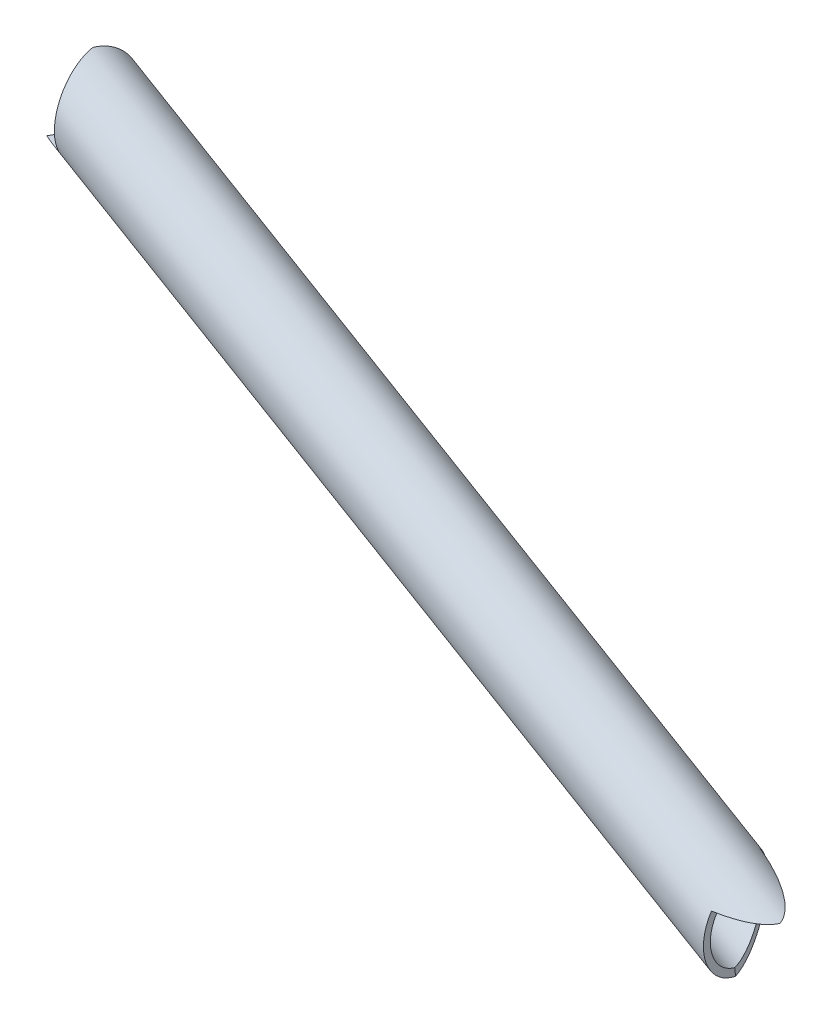
ISO-10303-21;
HEADER;
FILE_DESCRIPTION(('STEP AP214'),'2;1');
FILE_NAME('part.step','',(''),(''),'','','');
FILE_SCHEMA(('AUTOMOTIVE_DESIGN { 1 0 10303 214 1 1 1 1 }'));
ENDSEC;
DATA;
#1=APPLICATION_CONTEXT('core data for automotive mechanical design processes');
#2=APPLICATION_PROTOCOL_DEFINITION('international standard','automotive_design',2000,#1);
#3=PRODUCT_CONTEXT('',#1,'mechanical');
#4=PRODUCT('Part','Part','',(#3));
#5=PRODUCT_RELATED_PRODUCT_CATEGORY('part','',(#4));
#6=PRODUCT_DEFINITION_FORMATION('','',#4);
#7=PRODUCT_DEFINITION_CONTEXT('part definition',#1,'design');
#8=PRODUCT_DEFINITION('design','',#6,#7);
#9=PRODUCT_DEFINITION_SHAPE('','',#8);
#10=(LENGTH_UNIT() NAMED_UNIT(*) SI_UNIT(.MILLI.,.METRE.));
#11=(NAMED_UNIT(*) PLANE_ANGLE_UNIT() SI_UNIT($,.RADIAN.));
#12=(NAMED_UNIT(*) SI_UNIT($,.STERADIAN.) SOLID_ANGLE_UNIT());
#13=UNCERTAINTY_MEASURE_WITH_UNIT(LENGTH_MEASURE(1.E-05),#10,'distance_accuracy_value','');
#14=(GEOMETRIC_REPRESENTATION_CONTEXT(3) GLOBAL_UNCERTAINTY_ASSIGNED_CONTEXT((#13)) GLOBAL_UNIT_ASSIGNED_CONTEXT((#10,
#11,#12)) REPRESENTATION_CONTEXT('',''));
#15=CARTESIAN_POINT('',(0.,0.,0.));
#16=DIRECTION('',(0.,0.,1.));
#17=DIRECTION('',(1.,0.,0.));
#18=AXIS2_PLACEMENT_3D('',#15,#16,#17);
#19=CARTESIAN_POINT('',(-250.,0.,-1700.));
#20=DIRECTION('',(-0.214351342090107,0.914565726251124,0.342962147344171));
#21=DIRECTION('',(0.,-0.351123441588391,0.936329177569045));
#22=AXIS2_PLACEMENT_3D('',#19,#20,#21);
#23=CYLINDRICAL_SURFACE('',#22,9.49999999999999);
#24=CARTESIAN_POINT('',(-239.782773736137,-12.8737095959373,-1698.60180246691));
#25=CARTESIAN_POINT('',(-239.984904507563,-12.7886082078608,-1698.3482522127));
#26=CARTESIAN_POINT('',(-240.191938558142,-12.6860622632831,-1698.10432907822));
#27=CARTESIAN_POINT('',(-240.611050528479,-12.453208478034,-1697.63448879093));
#28=CARTESIAN_POINT('',(-240.823136021454,-12.3228562739344,-1697.40860121384));
#29=CARTESIAN_POINT('',(-241.250802241758,-12.0383143609904,-1696.9714194477));
#30=CARTESIAN_POINT('',(-241.466397334256,-11.8839282308109,-1696.76026837595));
#31=CARTESIAN_POINT('',(-241.896726561842,-11.5559011151564,-1696.35300708307));
#32=CARTESIAN_POINT('',(-242.111461102958,-11.3822706956704,-1696.15688870739));
#33=CARTESIAN_POINT('',(-242.479398763028,-11.0683054802184,-1695.83008751514));
#34=CARTESIAN_POINT('',(-242.633258640527,-10.9319727544481,-1695.69626019106));
#35=CARTESIAN_POINT('',(-242.93883974417,-10.6510457763852,-1695.43493723017));
#36=CARTESIAN_POINT('',(-243.090560750689,-10.5064506832752,-1695.30744224024));
#37=CARTESIAN_POINT('',(-243.391256106805,-10.2092561792934,-1695.0581103784));
#38=CARTESIAN_POINT('',(-243.540226914559,-10.0566473041076,-1694.9362805323));
#39=CARTESIAN_POINT('',(-243.834356309037,-9.7438092012214,-1694.69794566552));
#40=CARTESIAN_POINT('',(-243.979515114301,-9.583580411853,-1694.58144033931));
#41=CARTESIAN_POINT('',(-244.264176445696,-9.25644694323641,-1694.35392681337));
#42=CARTESIAN_POINT('',(-244.403706285591,-9.08958507573345,-1694.24289128481));
#43=CARTESIAN_POINT('',(-244.676696832635,-8.74815455964329,-1694.02518470078));
#44=CARTESIAN_POINT('',(-244.810156646132,-8.57358478367616,-1693.9185142882));
#45=CARTESIAN_POINT('',(-245.069068415303,-8.21671859382032,-1693.70937673426));
#46=CARTESIAN_POINT('',(-245.194533690912,-8.03443592140339,-1693.60690270872));
#47=CARTESIAN_POINT('',(-245.435417489178,-7.66140026734501,-1693.40573602836));
#48=CARTESIAN_POINT('',(-245.550840229976,-7.47065089328934,-1693.30704179576));
#49=CARTESIAN_POINT('',(-245.735413338959,-7.1395479240192,-1693.14286692153));
#50=CARTESIAN_POINT('',(-245.807944739844,-7.00155397032601,-1693.07643139454));
#51=CARTESIAN_POINT('',(-245.945363238874,-6.72091937404667,-1692.94541256909));
#52=CARTESIAN_POINT('',(-246.010250179179,-6.5782786355924,-1692.8808293089));
#53=CARTESIAN_POINT('',(-246.13070361321,-6.28842770874082,-1692.75381246663));
#54=CARTESIAN_POINT('',(-246.186283180957,-6.14122428015556,-1692.69137596873));
#55=CARTESIAN_POINT('',(-246.28638796432,-5.84208764528631,-1692.56895225868));
#56=CARTESIAN_POINT('',(-246.330914984382,-5.69015521562605,-1692.50896464807));
#57=CARTESIAN_POINT('',(-246.401064146233,-5.4056768167258,-1692.4011092055));
#58=CARTESIAN_POINT('',(-246.428543611619,-5.27375904827859,-1692.35280002927));
#59=CARTESIAN_POINT('',(-246.4730194334,-5.00720749076939,-1692.25895916768));
#60=CARTESIAN_POINT('',(-246.490018785702,-4.87257448927593,-1692.2134266919));
#61=CARTESIAN_POINT('',(-246.512579758404,-4.60138852262389,-1692.12587587786));
#62=CARTESIAN_POINT('',(-246.51815571958,-4.46483818168502,-1692.08385319714));
#63=CARTESIAN_POINT('',(-246.51735793179,-4.19052709141153,-1692.004046707));
#64=CARTESIAN_POINT('',(-246.510984388051,-4.05276636290512,-1691.96626282479));
#65=CARTESIAN_POINT('',(-246.486234587983,-3.77665666789734,-1691.89563935765));
#66=CARTESIAN_POINT('',(-246.467826110819,-3.63830711562667,-1691.86281333754));
#67=CARTESIAN_POINT('',(-246.419528281031,-3.36237048170564,-1691.80295386629));
#68=CARTESIAN_POINT('',(-246.389638708616,-3.22478341470327,-1691.77592052606));
#69=CARTESIAN_POINT('',(-246.31934589012,-2.95096486554247,-1691.72818344302));
#70=CARTESIAN_POINT('',(-246.278924637146,-2.81473612410064,-1691.70749067436));
#71=CARTESIAN_POINT('',(-246.188914149363,-2.54445036430349,-1691.67289867943));
#72=CARTESIAN_POINT('',(-246.139322307312,-2.41039397537639,-1691.65900138924));
#73=CARTESIAN_POINT('',(-246.016567472204,-2.10549818540933,-1691.63518991416));
#74=CARTESIAN_POINT('',(-245.940774073814,-1.93552837276018,-1691.62767575705));
#75=CARTESIAN_POINT('',(-245.779244833946,-1.60027876174664,-1691.62477114084));
#76=CARTESIAN_POINT('',(-245.693505728405,-1.43500052537825,-1691.62938467272));
#77=CARTESIAN_POINT('',(-245.514702018419,-1.10904672346668,-1691.65081181746));
#78=CARTESIAN_POINT('',(-245.421628959027,-0.948376770334281,-1691.66763970063));
#79=CARTESIAN_POINT('',(-245.2305657777,-0.631811360013427,-1691.7134730892));
#80=CARTESIAN_POINT('',(-245.132576031124,-0.475915539807728,-1691.74247766623));
#81=CARTESIAN_POINT('',(-244.930625609202,-0.16421280580895,-1691.81363633932));
#82=CARTESIAN_POINT('',(-244.826573992688,-0.00854930846927543,-1691.85615935165));
#83=CARTESIAN_POINT('',(-244.617108724015,0.297778397155349,-1691.95392180841));
#84=CARTESIAN_POINT('',(-244.511695068131,0.448442591762161,-1692.00916128763));
#85=CARTESIAN_POINT('',(-244.301079001451,0.744632655570074,-1692.13219796086));
#86=CARTESIAN_POINT('',(-244.195876537772,0.890160018648549,-1692.19999146751));
#87=CARTESIAN_POINT('',(-243.987005724939,1.17592326133598,-1692.34796858667));
#88=CARTESIAN_POINT('',(-243.883337442074,1.31615891270223,-1692.42815273285));
#89=CARTESIAN_POINT('',(-243.659529315486,1.61686914254613,-1692.61689938145));
#90=CARTESIAN_POINT('',(-243.539951152114,1.7762004049449,-1692.72796343162));
#91=CARTESIAN_POINT('',(-243.306495135971,2.08634710654732,-1692.966773229));
#92=CARTESIAN_POINT('',(-243.192617936426,2.23716157013431,-1693.09452088183));
#93=CARTESIAN_POINT('',(-242.97219015376,2.52951289049408,-1693.36605802462));
#94=CARTESIAN_POINT('',(-242.8656411977,2.67104768661416,-1693.5098510586));
#95=CARTESIAN_POINT('',(-242.661378121538,2.94391690089251,-1693.8125872656));
#96=CARTESIAN_POINT('',(-242.563663420567,3.07525198961939,-1693.97152944111));
#97=CARTESIAN_POINT('',(-242.381326570691,3.322770204905,-1694.2981698249));
#98=CARTESIAN_POINT('',(-242.296385135424,3.43930408637029,-1694.46542401763));
#99=CARTESIAN_POINT('',(-242.136975738934,3.66111675783399,-1694.8119611485));
#100=CARTESIAN_POINT('',(-242.062507659166,3.76639567521974,-1694.99124395047));
#101=CARTESIAN_POINT('',(-241.924862331054,3.96486248813064,-1695.36044000382));
#102=CARTESIAN_POINT('',(-241.861681641246,4.05805406663872,-1695.55034999177));
#103=CARTESIAN_POINT('',(-241.747161282898,4.23164642972749,-1695.93935913011));
#104=CARTESIAN_POINT('',(-241.695821212727,4.31204764812559,-1696.13845796855));
#105=CARTESIAN_POINT('',(-241.607567834595,4.45576081484985,-1696.53417145043));
#106=CARTESIAN_POINT('',(-241.570065243606,4.51972261103556,-1696.73041945719));
#107=CARTESIAN_POINT('',(-241.506150776301,4.63505208338413,-1697.12833714145));
#108=CARTESIAN_POINT('',(-241.479738468573,4.68642024940655,-1697.33000660773));
#109=CARTESIAN_POINT('',(-241.437897101561,4.77618367232106,-1697.73730214879));
#110=CARTESIAN_POINT('',(-241.422466816218,4.81458037712624,-1697.94292777925));
#111=CARTESIAN_POINT('',(-241.402279785461,4.87811332158674,-1698.35673297903));
#112=CARTESIAN_POINT('',(-241.397523284611,4.90324925739433,-1698.56491260676));
#113=CARTESIAN_POINT('',(-241.39819594792,4.94027005706469,-1698.98523507803));
#114=CARTESIAN_POINT('',(-241.403762364133,4.95197296458268,-1699.19739366199));
#115=CARTESIAN_POINT('',(-241.424644473177,4.96130952944614,-1699.62153431078));
#116=CARTESIAN_POINT('',(-241.439960270711,4.95894303569219,-1699.83351637367));
#117=CARTESIAN_POINT('',(-241.479457167178,4.93992859321801,-1700.25618931253));
#118=CARTESIAN_POINT('',(-241.503645927718,4.92326828541108,-1700.46687891214));
#119=CARTESIAN_POINT('',(-241.559776436016,4.87541098332842,-1700.88555371612));
#120=CARTESIAN_POINT('',(-241.591718308007,4.84421375611319,-1701.0935388771));
#121=CARTESIAN_POINT('',(-241.66416628956,4.76460327525255,-1701.51824522193));
#122=CARTESIAN_POINT('',(-241.705076713404,4.71525376813738,-1701.73472270307));
#123=CARTESIAN_POINT('',(-241.792176829963,4.59929836934876,-1702.16197411789));
#124=CARTESIAN_POINT('',(-241.838367545024,4.532689132746,-1702.37274693725));
#125=CARTESIAN_POINT('',(-241.933568215952,4.38157403378369,-1702.78695182242));
#126=CARTESIAN_POINT('',(-241.982576054687,4.29708148630177,-1702.99038921859));
#127=CARTESIAN_POINT('',(-242.080420264585,4.10931046422812,-1703.3884172921));
#128=CARTESIAN_POINT('',(-242.129256706056,4.00604091945804,-1703.58301211997));
#129=CARTESIAN_POINT('',(-242.207765661517,3.81656566505128,-1703.89995785386));
#130=CARTESIAN_POINT('',(-242.238512463013,3.73570469218492,-1704.0252527585));
#131=CARTESIAN_POINT('',(-242.296834694988,3.56480956545219,-1704.27017982362));
#132=CARTESIAN_POINT('',(-242.324411102474,3.47477825378458,-1704.3898137219));
#133=CARTESIAN_POINT('',(-242.374858152179,3.28567467697022,-1704.6223525378));
#134=CARTESIAN_POINT('',(-242.397738825328,3.18662235033572,-1704.73527142527));
#135=CARTESIAN_POINT('',(-242.437345779172,2.97952148784547,-1704.95373326378));
#136=CARTESIAN_POINT('',(-242.454072138999,2.87147306768104,-1705.05927630966));
#137=CARTESIAN_POINT('',(-242.480089087078,2.64588128959922,-1705.26302767651));
#138=CARTESIAN_POINT('',(-242.489306442902,2.52825644403712,-1705.36115548604));
#139=CARTESIAN_POINT('',(-242.49892419503,2.28548555176499,-1705.54809462404));
#140=CARTESIAN_POINT('',(-242.49932524565,2.16034006390145,-1705.63690664341));
#141=CARTESIAN_POINT('',(-242.490739545977,1.90389302304525,-1705.80471017669));
#142=CARTESIAN_POINT('',(-242.48175013867,1.77258973775727,-1705.88369890402));
#143=CARTESIAN_POINT('',(-242.454429702198,1.50542550653194,-1706.03170911728));
#144=CARTESIAN_POINT('',(-242.436097322473,1.36956390432671,-1706.10072916035));
#145=CARTESIAN_POINT('',(-242.386909492675,1.07203352632054,-1706.23970639088));
#146=CARTESIAN_POINT('',(-242.3544832543,0.909815982047556,-1706.3079270159));
#147=CARTESIAN_POINT('',(-242.279244026843,0.583163174762814,-1706.43216714881));
#148=CARTESIAN_POINT('',(-242.236428136462,0.418727304420591,-1706.48818324029));
#149=CARTESIAN_POINT('',(-242.142046925034,0.0885597679179744,-1706.5893703803));
#150=CARTESIAN_POINT('',(-242.090457988809,-0.0771742124945321,-1706.63451134108));
#151=CARTESIAN_POINT('',(-241.980293387157,-0.408736568126574,-1706.71501578558));
#152=CARTESIAN_POINT('',(-241.921714529352,-0.574564951786755,-1706.75037477711));
#153=CARTESIAN_POINT('',(-241.801426198685,-0.89949240345144,-1706.81122707592));
#154=CARTESIAN_POINT('',(-241.739920610906,-1.05860747043176,-1706.83704453668));
#155=CARTESIAN_POINT('',(-241.612989303708,-1.37622462586454,-1706.88146211052));
#156=CARTESIAN_POINT('',(-241.547564214524,-1.53472680852544,-1706.90006338034));
#157=CARTESIAN_POINT('',(-241.346714649815,-2.00956289118101,-1706.94612423069));
#158=CARTESIAN_POINT('',(-241.206813675778,-2.32497053804832,-1706.96379532817));
#159=CARTESIAN_POINT('',(-240.920470658444,-2.95434518568089,-1706.97677358879));
#160=CARTESIAN_POINT('',(-240.77400876207,-3.26830412796805,-1706.9720075938));
#161=CARTESIAN_POINT('',(-240.479120942279,-3.89412260849083,-1706.94189877715));
#162=CARTESIAN_POINT('',(-240.330695858963,-4.20598296373506,-1706.91656449375));
#163=CARTESIAN_POINT('',(-240.012651141794,-4.87522713338875,-1706.84073791011));
#164=CARTESIAN_POINT('',(-239.843230561255,-5.2323429802344,-1706.78701319758));
#165=CARTESIAN_POINT('',(-239.510271699,-5.94455982490911,-1706.65287721988));
#166=CARTESIAN_POINT('',(-239.346736279115,-6.29965977360659,-1706.57245316063));
#167=CARTESIAN_POINT('',(-239.030756957091,-7.00528591467498,-1706.3835930406));
#168=CARTESIAN_POINT('',(-238.878263942306,-7.35582583520751,-1706.27529220658));
#169=CARTESIAN_POINT('',(-238.588664910024,-8.05200602267758,-1706.02751994635));
#170=CARTESIAN_POINT('',(-238.451543340653,-8.3976509269423,-1705.8880804597));
#171=CARTESIAN_POINT('',(-238.212971938757,-9.04314944291669,-1705.59091168341));
#172=CARTESIAN_POINT('',(-238.109256648542,-9.34385372025536,-1705.43688807558));
#173=CARTESIAN_POINT('',(-237.925116634892,-9.93490781636197,-1705.09631763009));
#174=CARTESIAN_POINT('',(-237.844718209843,-10.2252456220873,-1704.90973444629));
#175=CARTESIAN_POINT('',(-237.747672727899,-10.648375520144,-1704.60140589349));
#176=CARTESIAN_POINT('',(-237.719137777752,-10.7882649139691,-1704.49305028107));
#177=CARTESIAN_POINT('',(-237.671590659726,-11.0617573316153,-1704.26660353725));
#178=CARTESIAN_POINT('',(-237.652579527098,-11.1953596705964,-1704.1485113491));
#179=CARTESIAN_POINT('',(-237.625522449639,-11.4540623348647,-1703.9028159078));
#180=CARTESIAN_POINT('',(-237.617446673069,-11.5791849024489,-1703.77523953596));
#181=CARTESIAN_POINT('',(-237.613546418331,-11.8191361309444,-1703.51058289891));
#182=CARTESIAN_POINT('',(-237.617714816277,-11.933970737515,-1703.37350820532));
#183=CARTESIAN_POINT('',(-237.636018667464,-12.1168557276919,-1703.13521580682));
#184=CARTESIAN_POINT('',(-237.646606667384,-12.1882603842567,-1703.03628124027));
#185=CARTESIAN_POINT('',(-237.67432186576,-12.3243891376809,-1702.83480749898));
#186=CARTESIAN_POINT('',(-237.691447457684,-12.3891148708436,-1702.73226921541));
#187=CARTESIAN_POINT('',(-237.732350388845,-12.5111652059165,-1702.52424096198));
#188=CARTESIAN_POINT('',(-237.756123606492,-12.5684943616898,-1702.4187528574));
#189=CARTESIAN_POINT('',(-237.810288770367,-12.6752333893366,-1702.20548431336));
#190=CARTESIAN_POINT('',(-237.840680951247,-12.7246429803415,-1702.09770379276));
#191=CARTESIAN_POINT('',(-237.907879745562,-12.8151487638807,-1701.88064763044));
#192=CARTESIAN_POINT('',(-237.944687125655,-12.8562439615206,-1701.77137181147));
#193=CARTESIAN_POINT('',(-238.024363023426,-12.9299352428935,-1701.5521262838));
#194=CARTESIAN_POINT('',(-238.06723365976,-12.9625283444063,-1701.44215634545));
#195=CARTESIAN_POINT('',(-238.158573577441,-13.0192348076345,-1701.22226477725));
#196=CARTESIAN_POINT('',(-238.207046942581,-13.0433419315341,-1701.11234324201));
#197=CARTESIAN_POINT('',(-238.309005833478,-13.083253791111,-1700.89331212427));
#198=CARTESIAN_POINT('',(-238.362492519733,-13.0990565988596,-1700.78420273612));
#199=CARTESIAN_POINT('',(-238.489987459262,-13.1261190930141,-1700.53603333144));
#200=CARTESIAN_POINT('',(-238.565458745107,-13.1347453737587,-1700.39743190635));
#201=CARTESIAN_POINT('',(-238.722458862374,-13.1397594948343,-1700.12350669711));
#202=CARTESIAN_POINT('',(-238.80399009988,-13.1361424483308,-1699.98818424344));
#203=CARTESIAN_POINT('',(-239.055962897896,-13.1085785299719,-1699.58800431886));
#204=CARTESIAN_POINT('',(-239.233853076416,-13.0679311750164,-1699.32880194807));
#205=CARTESIAN_POINT('',(-239.477296611977,-12.990431107731,-1698.99730550257));
#206=CARTESIAN_POINT('',(-239.537702005632,-12.9695066218156,-1698.91685062366));
#207=CARTESIAN_POINT('',(-239.659510995368,-12.924165296314,-1698.75789946498));
#208=CARTESIAN_POINT('',(-239.720912737346,-12.8997544026125,-1698.67940011253));
#209=CARTESIAN_POINT('',(-239.782773736137,-12.8737095959373,-1698.60180246691));
#210=B_SPLINE_CURVE_WITH_KNOTS('',3,(#24,#25,#26,#27,#28,#29,#30,#31,#32,#33,#34,#35,#36,#37,
#38,#39,#40,#41,#42,#43,#44,#45,#46,#47,#48,#49,#50,#51,#52,#53,#54,#55,#56,#57,#58,#59,#60,#61,
#62,#63,#64,#65,#66,#67,#68,#69,#70,#71,#72,#73,#74,#75,#76,#77,#78,#79,#80,#81,#82,#83,#84,#85,
#86,#87,#88,#89,#90,#91,#92,#93,#94,#95,#96,#97,#98,#99,#100,#101,#102,#103,#104,#105,#106,#107,
#108,#109,#110,#111,#112,#113,#114,#115,#116,#117,#118,#119,#120,#121,#122,#123,#124,#125,#126,
#127,#128,#129,#130,#131,#132,#133,#134,#135,#136,#137,#138,#139,#140,#141,#142,#143,#144,#145,
#146,#147,#148,#149,#150,#151,#152,#153,#154,#155,#156,#157,#158,#159,#160,#161,#162,#163,#164,
#165,#166,#167,#168,#169,#170,#171,#172,#173,#174,#175,#176,#177,#178,#179,#180,#181,#182,#183,
#184,#185,#186,#187,#188,#189,#190,#191,#192,#193,#194,#195,#196,#197,#198,#199,#200,#201,#202,
#203,#204,#205,#206,#207,#208,#209),.UNSPECIFIED.,.T.,.F.,(4,2,2,2,2,2,2,2,2,2,2,2,2,2,2,2,2,2,
2,2,2,2,2,2,2,2,2,2,2,2,2,2,2,2,2,2,2,2,2,2,2,2,2,2,2,2,2,2,2,2,2,2,2,2,2,2,2,2,2,2,2,2,2,2,2,2,
2,2,2,2,2,2,2,2,2,2,2,2,2,2,2,2,2,2,2,2,2,2,2,2,2,2,4),(0.,1.00555230707435,2.01272108217907,
3.02860094306077,4.04392577720049,4.7795868671537,5.51532295522028,6.25194839882344,
6.98853151952512,7.72095484963138,8.45348566317281,9.18476222438442,9.91573013146101,
10.4239092480488,10.9320988555603,11.4395685122029,11.946955264471,12.3760107477622,
12.8049435217558,13.2333374883864,13.6617240976458,14.0912623388206,14.520808803386,
14.9510945747321,15.3815028669501,15.939431952306,16.4975446641396,17.0563104837928,
17.615033709778,18.1905448259915,18.7660575166787,19.3414014360012,19.9167701428227,
20.6001618248875,21.2836316327246,21.9672527021122,22.650828789466,23.3124919734014,
23.9741476676247,24.635601280968,25.2970324546534,25.9256551959606,26.5542534815919,
27.1827815780112,27.8113240754461,28.4482835611713,29.0852498875843,29.7227675199586,
30.3602953682623,31.036815178347,31.7134661959115,32.3896151794566,33.0654434422817,
33.5218620809983,33.9781396880808,34.433432219272,34.8887188962268,35.3483943734266,
35.8080357350366,36.2678071866068,36.7276451186442,37.2636110670955,37.7997268559651,
38.3373092839496,38.875138178562,39.3925059041472,39.9097906619757,40.9451901196755,
41.9839679234496,43.0223147318742,44.2181167221879,45.4144925577534,46.6051708408579,
47.7946333850762,48.8530951351698,49.9127460904308,50.4499362675274,50.9871848251859,
51.5229647916373,52.0584330931782,52.4254746174124,52.7924260037015,53.1591503792384,
53.5258877578331,53.8926689940382,54.2595787110324,54.6267575731171,54.9940216417733,
55.4674405270594,55.941048396306,56.8878195736468,57.1960828510787,57.5038265440026),.UNSPECIFIED.);
#211=CARTESIAN_POINT('',(-238.275469808564,-8.87542708308326,-1705.66706450957));
#212=VERTEX_POINT('',#211);
#213=CARTESIAN_POINT('',(-242.13529505725,-11.3593996180337,-1696.13718002754));
#214=VERTEX_POINT('',#213);
#215=EDGE_CURVE('E177',#212,#214,#210,.T.);
#216=ORIENTED_EDGE('',*,*,#215,.F.);
#217=CARTESIAN_POINT('',(-232.820393226593,-73.299655566537,-1727.48737083745));
#218=DIRECTION('',(-0.970142500145332,0.,-0.242535625036333));
#219=DIRECTION('',(-0.0940407512885348,0.921768805422756,0.376163005154139));
#220=AXIS2_PLACEMENT_3D('',#217,#218,#219);
#221=ELLIPSE('',#220,76.1396046117399,9.49999999999999);
#222=CARTESIAN_POINT('',(-238.075805823074,-10.,-1706.46572045153));
#223=VERTEX_POINT('',#222);
#224=EDGE_CURVE('E241',#212,#223,#221,.T.);
#225=ORIENTED_EDGE('',*,*,#224,.T.);
#226=CARTESIAN_POINT('',(-247.65625,-10.,-1703.75));
#227=DIRECTION('',(0.,1.,0.));
#228=DIRECTION('',(-0.52999894000318,0.,0.847998304005088));
#229=AXIS2_PLACEMENT_3D('',#226,#227,#228);
#230=ELLIPSE('',#229,10.3874437094218,9.49999999999999);
#231=CARTESIAN_POINT('',(-238.168722071905,-10.,-1706.90270720181));
#232=VERTEX_POINT('',#231);
#233=EDGE_CURVE('E135',#223,#232,#230,.T.);
#234=ORIENTED_EDGE('',*,*,#233,.T.);
#235=CARTESIAN_POINT('',(-250.,-1.12648982103456E-13,-1700.));
#236=DIRECTION('',(-0.71506324481371,-0.537405268133699,-0.447079560815114));
#237=DIRECTION('',(-0.649756055025887,0.746861985871362,0.141471703946348));
#238=AXIS2_PLACEMENT_3D('',#235,#236,#237);
#239=ELLIPSE('',#238,19.3266576466284,9.49999999999999);
#240=CARTESIAN_POINT('',(-242.343886979706,-13.1916255339826,-1696.38846375506));
#241=VERTEX_POINT('',#240);
#242=EDGE_CURVE('E141',#232,#241,#239,.T.);
#243=ORIENTED_EDGE('',*,*,#242,.T.);
#244=CARTESIAN_POINT('',(-250.,0.,-1700.));
#245=DIRECTION('',(-0.508456010272344,-0.0599232902931692,0.859000398660194));
#246=DIRECTION('',(0.0394871934442316,-0.998148808069163,-0.0462570913915509));
#247=AXIS2_PLACEMENT_3D('',#244,#245,#246);
#248=ELLIPSE('',#247,27.2370926599014,9.49999999999999);
#249=EDGE_CURVE('E244',#214,#241,#248,.F.);
#250=ORIENTED_EDGE('',*,*,#249,.F.);
#251=EDGE_LOOP('',(#216,#225,#234,#243,#250));
#252=FACE_BOUND('',#251,.T.);
#253=ADVANCED_FACE('F41',(#252),#23,.F.);
#254=CARTESIAN_POINT('',(-115.,920.,-1946.51325703663));
#255=DIRECTION('',(-0.140336447675245,-0.956366902675742,0.256257739239816));
#256=DIRECTION('',(0.,-0.258819045102517,-0.965925826289069));
#257=AXIS2_PLACEMENT_3D('',#254,#255,#256);
#258=CYLINDRICAL_SURFACE('',#257,9.49999999999999);
#259=CARTESIAN_POINT('',(-250.,-2.08166817117217E-13,-1700.));
#260=DIRECTION('',(-0.872585214874351,-0.470357898518335,0.131751622700061));
#261=DIRECTION('',(-0.488413504418264,0.843958437392222,-0.221780081739432));
#262=AXIS2_PLACEMENT_3D('',#259,#260,#261);
#263=ELLIPSE('',#262,15.6752068398415,9.49999999999999);
#264=CARTESIAN_POINT('',(-243.437962250656,-10.,-1692.24026153614));
#265=VERTEX_POINT('',#264);
#266=EDGE_CURVE('E247',#241,#265,#263,.T.);
#267=ORIENTED_EDGE('',*,*,#266,.T.);
#268=CARTESIAN_POINT('',(-251.467391304348,-10.,-1697.32050807569));
#269=DIRECTION('',(0.,1.,0.));
#270=DIRECTION('',(-0.480327336741099,0.,0.87708930536132));
#271=AXIS2_PLACEMENT_3D('',#268,#269,#270);
#272=ELLIPSE('',#271,9.93342614996473,9.49999999999999);
#273=CARTESIAN_POINT('',(-242.494210145051,-10.,-1694.16838502064));
#274=VERTEX_POINT('',#273);
#275=EDGE_CURVE('E142',#265,#274,#272,.T.);
#276=ORIENTED_EDGE('',*,*,#275,.T.);
#277=CARTESIAN_POINT('',(-242.272833901891,-11.8252632103567,-1698.86391406331));
#278=CARTESIAN_POINT('',(-242.24901606336,-11.8352931326053,-1698.71191995643));
#279=CARTESIAN_POINT('',(-242.227554861436,-11.8397636611331,-1698.55920272901));
#280=CARTESIAN_POINT('',(-242.189765147747,-11.837049824688,-1698.25324861373));
#281=CARTESIAN_POINT('',(-242.173435405501,-11.8298682563368,-1698.10001185937));
#282=CARTESIAN_POINT('',(-242.14626328473,-11.8034890967169,-1697.79415643685));
#283=CARTESIAN_POINT('',(-242.135418153662,-11.7842975436987,-1697.64153749686));
#284=CARTESIAN_POINT('',(-242.119444743218,-11.7337661787255,-1697.33800918353));
#285=CARTESIAN_POINT('',(-242.114316620254,-11.7024260344243,-1697.18709985707));
#286=CARTESIAN_POINT('',(-242.109884046011,-11.627661608996,-1696.88795342179));
#287=CARTESIAN_POINT('',(-242.110589153967,-11.5842176052093,-1696.73972109838));
#288=CARTESIAN_POINT('',(-242.117809673678,-11.4856611713357,-1696.44733802221));
#289=CARTESIAN_POINT('',(-242.124325091247,-11.4305487295731,-1696.30318727355));
#290=CARTESIAN_POINT('',(-242.14299012713,-11.3092753986418,-1696.01996776961));
#291=CARTESIAN_POINT('',(-242.155140787984,-11.2431124665436,-1695.88089995983));
#292=CARTESIAN_POINT('',(-242.18478287183,-11.1005288473031,-1695.60866192606));
#293=CARTESIAN_POINT('',(-242.202276495637,-11.0241039404413,-1695.47549415829));
#294=CARTESIAN_POINT('',(-242.241706602052,-10.8639913401546,-1695.21903359039));
#295=CARTESIAN_POINT('',(-242.263519650165,-10.7805359645552,-1695.0955762916));
#296=CARTESIAN_POINT('',(-242.311433158011,-10.6056591086608,-1694.85528959482));
#297=CARTESIAN_POINT('',(-242.337534935487,-10.5142351840386,-1694.73846224883));
#298=CARTESIAN_POINT('',(-242.421589659603,-10.2294274489904,-1694.39840164018));
#299=CARTESIAN_POINT('',(-242.485316221453,-10.0254113865809,-1694.18543828878));
#300=CARTESIAN_POINT('',(-242.665405890714,-9.46974373005584,-1693.67076583362));
#301=CARTESIAN_POINT('',(-242.790750967265,-9.10155134000096,-1693.39003346173));
#302=CARTESIAN_POINT('',(-242.991609744405,-8.5229342649008,-1693.01765218428));
#303=CARTESIAN_POINT('',(-243.060857574004,-8.32524279309952,-1692.90145741457));
#304=CARTESIAN_POINT('',(-243.202346543797,-7.92255633564345,-1692.68446294646));
#305=CARTESIAN_POINT('',(-243.274587521541,-7.71756174644255,-1692.58366241395));
#306=CARTESIAN_POINT('',(-243.451878957689,-7.21314319568169,-1692.35688458292));
#307=CARTESIAN_POINT('',(-243.557813202092,-6.91064660297127,-1692.23843903713));
#308=CARTESIAN_POINT('',(-243.769612757725,-6.29611597103512,-1692.02909820822));
#309=CARTESIAN_POINT('',(-243.875477987832,-5.98407624247797,-1691.93821972666));
#310=CARTESIAN_POINT('',(-244.083168540565,-5.35238812460415,-1691.78267096846));
#311=CARTESIAN_POINT('',(-244.184995390003,-5.03274268537954,-1691.71799070004));
#312=CARTESIAN_POINT('',(-244.379906489696,-4.38684709317715,-1691.61414740701));
#313=CARTESIAN_POINT('',(-244.472996381335,-4.06060136971424,-1691.57496781843));
#314=CARTESIAN_POINT('',(-244.606024002778,-3.54830955358096,-1691.5341492602));
#315=CARTESIAN_POINT('',(-244.651213963526,-3.36430913250628,-1691.52356634036));
#316=CARTESIAN_POINT('',(-244.73539389497,-2.99462457528309,-1691.51067583913));
#317=CARTESIAN_POINT('',(-244.774385317048,-2.80894084407528,-1691.50836631781));
#318=CARTESIAN_POINT('',(-244.844322433224,-2.43636783466992,-1691.51242892684));
#319=CARTESIAN_POINT('',(-244.875278931164,-2.2494805252014,-1691.5187893268));
#320=CARTESIAN_POINT('',(-244.927010642199,-1.87490787464769,-1691.54074034348));
#321=CARTESIAN_POINT('',(-244.947788543968,-1.68722275753047,-1691.55632852029));
#322=CARTESIAN_POINT('',(-244.983899887435,-1.21595106468532,-1691.60802566084));
#323=CARTESIAN_POINT('',(-244.99106599774,-0.932222626481231,-1691.65054336379));
#324=CARTESIAN_POINT('',(-244.97306276575,-0.51199365925161,-1691.73332889125));
#325=CARTESIAN_POINT('',(-244.962287821767,-0.372910155482079,-1691.76406308392));
#326=CARTESIAN_POINT('',(-244.930322245975,-0.0975358340346672,-1691.83212194064));
#327=CARTESIAN_POINT('',(-244.909132154636,0.0387551281727997,-1691.86944626264));
#328=CARTESIAN_POINT('',(-244.855651887986,0.308341495788431,-1691.95113163469));
#329=CARTESIAN_POINT('',(-244.823266494809,0.441600398370244,-1691.99555122859));
#330=CARTESIAN_POINT('',(-244.747594749901,0.702502184782535,-1692.09109107964));
#331=CARTESIAN_POINT('',(-244.704308623936,0.830145184859961,-1692.14221119802));
#332=CARTESIAN_POINT('',(-244.607559865315,1.07882753043034,-1692.25094339843));
#333=CARTESIAN_POINT('',(-244.55408449729,1.19985836526573,-1692.30856356762));
#334=CARTESIAN_POINT('',(-244.438267358558,1.43440198727526,-1692.42985644698));
#335=CARTESIAN_POINT('',(-244.375924137948,1.54791354058266,-1692.49353014636));
#336=CARTESIAN_POINT('',(-244.231849176212,1.78708925468244,-1692.63865249777));
#337=CARTESIAN_POINT('',(-244.148655627833,1.91118906800555,-1692.72122405627));
#338=CARTESIAN_POINT('',(-243.97460353199,2.14846477229859,-1692.89361625566));
#339=CARTESIAN_POINT('',(-243.883743141851,2.2616380230451,-1692.983438639));
#340=CARTESIAN_POINT('',(-243.696519452444,2.4777642043743,-1693.17003853497));
#341=CARTESIAN_POINT('',(-243.600144237638,2.58069357899285,-1693.26683123416));
#342=CARTESIAN_POINT('',(-243.404079253869,2.77669565039718,-1693.46685196926));
#343=CARTESIAN_POINT('',(-243.304388457721,2.86976525448552,-1693.57008200834));
#344=CARTESIAN_POINT('',(-243.062579930743,3.08259901803736,-1693.82590355888));
#345=CARTESIAN_POINT('',(-242.919674413305,3.1978537076722,-1693.98151540268));
#346=CARTESIAN_POINT('',(-242.63450080919,3.41157334294483,-1694.30444668055));
#347=CARTESIAN_POINT('',(-242.492232958995,3.51003249249152,-1694.47177012827));
#348=CARTESIAN_POINT('',(-242.211390035031,3.69117658924498,-1694.81772958253));
#349=CARTESIAN_POINT('',(-242.072815604293,3.77385880489259,-1694.9963675409));
#350=CARTESIAN_POINT('',(-241.802016270886,3.92403187393809,-1695.36447826269));
#351=CARTESIAN_POINT('',(-241.669790620829,3.99152451894532,-1695.55394974499));
#352=CARTESIAN_POINT('',(-241.412555771101,4.11229640413755,-1695.94542563187));
#353=CARTESIAN_POINT('',(-241.287645857654,4.16540509478925,-1696.14754815525));
#354=CARTESIAN_POINT('',(-241.048957979451,4.25641564543364,-1696.56159165327));
#355=CARTESIAN_POINT('',(-240.935180469238,4.29431688469336,-1696.77351302748));
#356=CARTESIAN_POINT('',(-240.720997657736,4.35474825629773,-1697.20594329374));
#357=CARTESIAN_POINT('',(-240.620581998707,4.37729035114529,-1697.42644536086));
#358=CARTESIAN_POINT('',(-240.435057065578,4.40683522157037,-1697.8748180535));
#359=CARTESIAN_POINT('',(-240.349946140552,4.41383967412229,-1698.10268788111));
#360=CARTESIAN_POINT('',(-240.201907582693,4.41217604158927,-1698.54893485106));
#361=CARTESIAN_POINT('',(-240.13789097887,4.40450594564613,-1698.76695408917));
#362=CARTESIAN_POINT('',(-240.026157465329,4.37535730351722,-1699.20624138757));
#363=CARTESIAN_POINT('',(-239.978440034478,4.35387919887842,-1699.42750934375));
#364=CARTESIAN_POINT('',(-239.900387444556,4.29719775925286,-1699.87119408815));
#365=CARTESIAN_POINT('',(-239.870039785266,4.26200432528952,-1700.09360993369));
#366=CARTESIAN_POINT('',(-239.827387548075,4.17813365676455,-1700.53762052918));
#367=CARTESIAN_POINT('',(-239.815080738065,4.12945809116975,-1700.75921537733));
#368=CARTESIAN_POINT('',(-239.80920792886,4.0261583599207,-1701.17112454479));
#369=CARTESIAN_POINT('',(-239.813440194412,3.97309848928507,-1701.36180472049));
#370=CARTESIAN_POINT('',(-239.835770740436,3.85748295190745,-1701.73943763041));
#371=CARTESIAN_POINT('',(-239.853868608853,3.79492756739527,-1701.92639047524));
#372=CARTESIAN_POINT('',(-239.90362362252,3.66083025604503,-1702.29516779696));
#373=CARTESIAN_POINT('',(-239.935279377822,3.58928925094004,-1702.47699279752));
#374=CARTESIAN_POINT('',(-240.011621796273,3.43777980817553,-1702.83428128497));
#375=CARTESIAN_POINT('',(-240.056308773968,3.35781116712081,-1703.00974461819));
#376=CARTESIAN_POINT('',(-240.157013442531,3.19166348681695,-1703.34988449638));
#377=CARTESIAN_POINT('',(-240.212796640257,3.10563350129524,-1703.51470361051));
#378=CARTESIAN_POINT('',(-240.335404236881,2.92657641032314,-1703.83631334256));
#379=CARTESIAN_POINT('',(-240.402232861575,2.83354663431942,-1703.99310085752));
#380=CARTESIAN_POINT('',(-240.545959613041,2.64108963059022,-1704.29777704877));
#381=CARTESIAN_POINT('',(-240.622853956703,2.54166481348991,-1704.44566903803));
#382=CARTESIAN_POINT('',(-240.785732204569,2.3368551668178,-1704.73202681753));
#383=CARTESIAN_POINT('',(-240.871717049369,2.23146972102527,-1704.87049162991));
#384=CARTESIAN_POINT('',(-241.060313050205,2.00480811808251,-1705.15025332858));
#385=CARTESIAN_POINT('',(-241.163727814976,1.88297552487075,-1705.29055792638));
#386=CARTESIAN_POINT('',(-241.37873972016,1.63302913360914,-1705.55874596081));
#387=CARTESIAN_POINT('',(-241.49033739059,1.50491492887013,-1705.68662859161));
#388=CARTESIAN_POINT('',(-241.720425273449,1.24236468478552,-1705.92978468704));
#389=CARTESIAN_POINT('',(-241.838928933925,1.10791641568334,-1706.04503219911));
#390=CARTESIAN_POINT('',(-242.081001619223,0.83296670855712,-1706.26222046415));
#391=CARTESIAN_POINT('',(-242.204570919262,0.692464941624284,-1706.36416049284));
#392=CARTESIAN_POINT('',(-242.472162416427,0.385553691136339,-1706.56732681763));
#393=CARTESIAN_POINT('',(-242.61666848976,0.218230893731083,-1706.66654437484));
#394=CARTESIAN_POINT('',(-242.907010689298,-0.125159520399956,-1706.84647213934));
#395=CARTESIAN_POINT('',(-243.052847329283,-0.301230642893272,-1706.92717485309));
#396=CARTESIAN_POINT('',(-243.341757998333,-0.662589859518246,-1707.06879078611));
#397=CARTESIAN_POINT('',(-243.484837995661,-0.847853943631151,-1707.12975271957));
#398=CARTESIAN_POINT('',(-243.763850694055,-1.22910709201889,-1707.23069161993));
#399=CARTESIAN_POINT('',(-243.899790192368,-1.42508558037414,-1707.27068888182));
#400=CARTESIAN_POINT('',(-244.102788529216,-1.74176096675837,-1707.31566982592));
#401=CARTESIAN_POINT('',(-244.174305529038,-1.85854339933481,-1707.3283141667));
#402=CARTESIAN_POINT('',(-244.311755887567,-2.09589068387486,-1707.34593338358));
#403=CARTESIAN_POINT('',(-244.377691388051,-2.21645406042319,-1707.35091121428));
#404=CARTESIAN_POINT('',(-244.502487521164,-2.46092384060734,-1707.35293466848));
#405=CARTESIAN_POINT('',(-244.561364204531,-2.58482184414978,-1707.34999865851));
#406=CARTESIAN_POINT('',(-244.670910113129,-2.83577701006902,-1707.33609587392));
#407=CARTESIAN_POINT('',(-244.721579454497,-2.96283412771438,-1707.32512921295));
#408=CARTESIAN_POINT('',(-244.813936193401,-3.2202293923547,-1707.295121912));
#409=CARTESIAN_POINT('',(-244.855560885172,-3.35058385976533,-1707.27602746176));
#410=CARTESIAN_POINT('',(-244.928703045392,-3.61274252475331,-1707.23005982667));
#411=CARTESIAN_POINT('',(-244.960220809599,-3.74454667979184,-1707.20318686949));
#412=CARTESIAN_POINT('',(-245.013022493761,-4.00864014046666,-1707.14215773692));
#413=CARTESIAN_POINT('',(-245.034296777673,-4.14092978541422,-1707.10799474722));
#414=CARTESIAN_POINT('',(-245.066950971688,-4.40490451701346,-1707.03305532051));
#415=CARTESIAN_POINT('',(-245.078325304763,-4.53658922138598,-1706.99227517112));
#416=CARTESIAN_POINT('',(-245.093911514366,-4.83664565436635,-1706.89206845479));
#417=CARTESIAN_POINT('',(-245.095067554704,-5.00451781029359,-1706.8306721879));
#418=CARTESIAN_POINT('',(-245.084302936424,-5.33652850260052,-1706.69945683097));
#419=CARTESIAN_POINT('',(-245.072374324964,-5.50066470634693,-1706.62963264141));
#420=CARTESIAN_POINT('',(-245.037688818092,-5.82494562278714,-1706.48249509742));
#421=CARTESIAN_POINT('',(-245.014898226778,-5.98507627130689,-1706.40515903827));
#422=CARTESIAN_POINT('',(-244.960588886296,-6.30045772795131,-1706.24403524873));
#423=CARTESIAN_POINT('',(-244.929071133349,-6.45570909080495,-1706.16024825551));
#424=CARTESIAN_POINT('',(-244.832319259483,-6.87845874433017,-1705.92026327159));
#425=CARTESIAN_POINT('',(-244.759763195714,-7.14074388952388,-1705.75780536667));
#426=CARTESIAN_POINT('',(-244.600753497442,-7.64985209944212,-1705.41619971071));
#427=CARTESIAN_POINT('',(-244.514289095752,-7.89666297729842,-1705.23703907474));
#428=CARTESIAN_POINT('',(-244.332742784679,-8.37461825915452,-1704.86249596884));
#429=CARTESIAN_POINT('',(-244.237653921916,-8.60574975465213,-1704.66710042052));
#430=CARTESIAN_POINT('',(-244.042946578635,-9.05121203708219,-1704.26026514069));
#431=CARTESIAN_POINT('',(-243.943329990723,-9.26554974366402,-1704.04883208864));
#432=CARTESIAN_POINT('',(-243.756205988244,-9.64845385288986,-1703.63899525299));
#433=CARTESIAN_POINT('',(-243.668866506099,-9.81930348319694,-1703.44264756014));
#434=CARTESIAN_POINT('',(-243.495038120911,-10.1458760699771,-1703.03729868456));
#435=CARTESIAN_POINT('',(-243.408549307774,-10.3015974427035,-1702.82829618074));
#436=CARTESIAN_POINT('',(-243.238423129296,-10.5956628451019,-1702.39776163813));
#437=CARTESIAN_POINT('',(-243.154781673027,-10.7340326449482,-1702.17624890632));
#438=CARTESIAN_POINT('',(-242.992186496513,-10.9910567834014,-1701.72042359549));
#439=CARTESIAN_POINT('',(-242.913231095224,-11.1097182198656,-1701.48611566516));
#440=CARTESIAN_POINT('',(-242.779356956184,-11.2997373754302,-1701.05984671403));
#441=CARTESIAN_POINT('',(-242.723056314198,-11.3757152185667,-1700.87037867779));
#442=CARTESIAN_POINT('',(-242.615638078509,-11.5122916574972,-1700.48449393136));
#443=CARTESIAN_POINT('',(-242.564520445561,-11.5728903697479,-1700.2880772738));
#444=CARTESIAN_POINT('',(-242.46877375673,-11.6767138599692,-1699.88958835643));
#445=CARTESIAN_POINT('',(-242.42413116102,-11.7199752359533,-1699.68752898354));
#446=CARTESIAN_POINT('',(-242.342466763209,-11.7873801907162,-1699.27873489289));
#447=CARTESIAN_POINT('',(-242.30544180118,-11.8115317084764,-1699.07200215339));
#448=CARTESIAN_POINT('',(-242.272833901891,-11.8252632103567,-1698.86391406331));
#449=B_SPLINE_CURVE_WITH_KNOTS('',3,(#277,#278,#279,#280,#281,#282,#283,#284,#285,#286,#287,
#288,#289,#290,#291,#292,#293,#294,#295,#296,#297,#298,#299,#300,#301,#302,#303,#304,#305,#306,
#307,#308,#309,#310,#311,#312,#313,#314,#315,#316,#317,#318,#319,#320,#321,#322,#323,#324,#325,
#326,#327,#328,#329,#330,#331,#332,#333,#334,#335,#336,#337,#338,#339,#340,#341,#342,#343,#344,
#345,#346,#347,#348,#349,#350,#351,#352,#353,#354,#355,#356,#357,#358,#359,#360,#361,#362,#363,
#364,#365,#366,#367,#368,#369,#370,#371,#372,#373,#374,#375,#376,#377,#378,#379,#380,#381,#382,
#383,#384,#385,#386,#387,#388,#389,#390,#391,#392,#393,#394,#395,#396,#397,#398,#399,#400,#401,
#402,#403,#404,#405,#406,#407,#408,#409,#410,#411,#412,#413,#414,#415,#416,#417,#418,#419,#420,
#421,#422,#423,#424,#425,#426,#427,#428,#429,#430,#431,#432,#433,#434,#435,#436,#437,#438,#439,
#440,#441,#442,#443,#444,#445,#446,#447,#448),.UNSPECIFIED.,.T.,.F.,(4,2,2,2,2,2,2,2,2,2,2,2,2,
2,2,2,2,2,2,2,2,2,2,2,2,2,2,2,2,2,2,2,2,2,2,2,2,2,2,2,2,2,2,2,2,2,2,2,2,2,2,2,2,2,2,2,2,2,2,2,2,
2,2,2,2,2,2,2,2,2,2,2,2,2,2,2,2,2,2,2,2,2,2,2,2,4),(0.,0.462370843343892,0.92463072940729,
1.38665839194596,1.84869869495751,2.31149631862383,2.77429440538305,3.23717814558146,
3.700252809602,4.15162622891659,4.60313859618344,5.50562511538001,6.93613157942556,
7.65432562468364,8.3724807416011,9.39614573653543,10.4204333861579,11.4443300124931,
12.4675609017265,13.0366174108077,13.6055404789348,14.1736945571548,14.7416984764894,
15.5990926734306,16.0271696748812,16.4552244647107,16.8870133442192,17.3187932816604,
17.7511164766328,18.1835104382779,18.6948392450838,19.2062912984395,19.7188935137322,
20.2316560429748,20.9526655845275,21.6739234431661,22.3953060646027,23.1166035543384,
23.8461121752915,24.5756505700694,25.3046201107799,26.0335109701356,26.7145859293829,
27.3956391105708,28.0762015510955,28.7566797817252,29.3498583203728,29.9430192317591,
30.5361193471005,31.1292337797845,31.7109390494697,32.2928673872183,32.8745776369509,
33.4563481352713,34.0936756926883,34.731044567106,35.3696989949754,36.0083881671555,
36.7345252349933,37.4609556765684,38.1855796021899,38.9095007489104,39.32175488168,
39.7338500971313,40.1449897427138,40.5561235700806,40.9700227251253,41.383909767176,
41.7981853957628,42.212694251153,42.7480768317173,43.2837849978076,43.8211659568803,
44.3584855981338,45.3078178654661,46.2578886303112,47.2087323067341,48.1591821179908,
48.982151473839,49.8052068920506,50.6270250728177,51.4485466355301,52.0831719575717,
52.7177924738359,53.3510661995317,53.984076700254),.UNSPECIFIED.);
#450=EDGE_CURVE('E184',#214,#274,#449,.T.);
#451=ORIENTED_EDGE('',*,*,#450,.F.);
#452=ORIENTED_EDGE('',*,*,#249,.T.);
#453=EDGE_LOOP('',(#267,#276,#451,#452));
#454=FACE_BOUND('',#453,.T.);
#455=ADVANCED_FACE('F43',(#454),#258,.F.);
#456=CARTESIAN_POINT('',(-60.0000000000001,-80.0000000000002,-1680.));
#457=DIRECTION('',(-0.917328644212009,0.386243639668214,-0.0965609099170536));
#458=DIRECTION('',(-0.388057000058133,-0.921635375138065,0.));
#459=AXIS2_PLACEMENT_3D('',#456,#457,#458);
#460=CYLINDRICAL_SURFACE('',#459,9.49999999999999);
#461=CARTESIAN_POINT('',(-226.250000000001,-10.,-1697.5));
#462=DIRECTION('',(0.,1.,0.));
#463=DIRECTION('',(-0.994505452921406,0.,-0.104684784518043));
#464=AXIS2_PLACEMENT_3D('',#461,#462,#463);
#465=ELLIPSE('',#464,24.5958742729345,9.49999999999999);
#466=CARTESIAN_POINT('',(-237.960015298345,-10.,-1706.92888255044));
#467=VERTEX_POINT('',#466);
#468=EDGE_CURVE('E133',#467,#232,#465,.T.);
#469=ORIENTED_EDGE('',*,*,#468,.F.);
#470=CARTESIAN_POINT('',(-239.956537578624,-4.22882628268501,-1698.94279342933));
#471=DIRECTION('',(-0.970142500145332,0.,-0.242535625036333));
#472=DIRECTION('',(-0.076728211310688,0.948639703477596,0.306912845242752));
#473=AXIS2_PLACEMENT_3D('',#470,#471,#472);
#474=ELLIPSE('',#473,10.4011679570996,9.49999999999999);
#475=CARTESIAN_POINT('',(-239.858774037238,6.03776419494773,-1699.33384759487));
#476=VERTEX_POINT('',#475);
#477=EDGE_CURVE('E118',#476,#467,#474,.T.);
#478=ORIENTED_EDGE('',*,*,#477,.F.);
#479=CARTESIAN_POINT('',(-239.812347515301,-4.28953788829459,-1698.92761552793));
#480=DIRECTION('',(-0.993532672656404,0.,0.113546591160732));
#481=DIRECTION('',(-0.0522307164495707,0.887922179642703,-0.457018768933745));
#482=AXIS2_PLACEMENT_3D('',#479,#480,#481);
#483=ELLIPSE('',#482,10.5504934589476,9.49999999999999);
#484=CARTESIAN_POINT('',(-238.842425919066,-10.,-1690.44080156087));
#485=VERTEX_POINT('',#484);
#486=EDGE_CURVE('E237',#485,#476,#483,.T.);
#487=ORIENTED_EDGE('',*,*,#486,.F.);
#488=EDGE_CURVE('E145',#265,#485,#465,.T.);
#489=ORIENTED_EDGE('',*,*,#488,.F.);
#490=ORIENTED_EDGE('',*,*,#266,.F.);
#491=ORIENTED_EDGE('',*,*,#242,.F.);
#492=EDGE_LOOP('',(#469,#478,#487,#489,#490,#491));
#493=FACE_BOUND('',#492,.T.);
#494=CARTESIAN_POINT('',(-70.0000000000002,-75.7894736842107,-1681.05263157895));
#495=DIRECTION('',(1.,0.,0.));
#496=DIRECTION('',(0.,0.970142500145332,-0.242535625036333));
#497=AXIS2_PLACEMENT_3D('',#494,#495,#496);
#498=ELLIPSE('',#497,10.356157588604,9.49999999999999);
#499=CARTESIAN_POINT('',(-70.0000000000002,-69.9999999999998,-1673.37369865446));
#500=VERTEX_POINT('',#499);
#501=CARTESIAN_POINT('',(-70.0000000000002,-85.9364534176569,-1678.99138984272));
#502=VERTEX_POINT('',#501);
#503=EDGE_CURVE('E11',#500,#502,#498,.T.);
#504=ORIENTED_EDGE('',*,*,#503,.F.);
#505=CARTESIAN_POINT('',(-83.7500000000009,-69.9999999999998,-1682.5));
#506=DIRECTION('',(0.,-1.,0.));
#507=DIRECTION('',(-0.994505452921406,0.,-0.104684784518043));
#508=AXIS2_PLACEMENT_3D('',#505,#506,#507);
#509=ELLIPSE('',#508,24.5958742729345,9.49999999999999);
#510=CARTESIAN_POINT('',(-59.5554108690359,-69.9999999999998,-1678.88114595562));
#511=VERTEX_POINT('',#510);
#512=EDGE_CURVE('E50',#511,#500,#509,.T.);
#513=ORIENTED_EDGE('',*,*,#512,.F.);
#514=CARTESIAN_POINT('',(-88.8957487218303,-67.8333689592296,-1683.04165776019));
#515=DIRECTION('',(-0.0393485848218571,-0.972627071428274,-0.229015870186713));
#516=DIRECTION('',(-0.980542619194856,0.0816981850649065,-0.178498119036565));
#517=AXIS2_PLACEMENT_3D('',#514,#515,#516);
#518=ELLIPSE('',#517,29.9248927403965,9.49999999999999);
#519=CARTESIAN_POINT('',(-74.2128921385556,-67.0692924253528,-1688.80942899853));
#520=VERTEX_POINT('',#519);
#521=EDGE_CURVE('E233',#520,#511,#518,.T.);
#522=ORIENTED_EDGE('',*,*,#521,.F.);
#523=CARTESIAN_POINT('',(-71.2080625089743,-75.2808157856953,-1681.17979605358));
#524=DIRECTION('',(0.94343640931858,0.0393485848218569,-0.3292103133934));
#525=DIRECTION('',(-0.252656200168243,0.728279271838357,-0.637004039804409));
#526=AXIS2_PLACEMENT_3D('',#523,#524,#525);
#527=ELLIPSE('',#526,11.6072461605859,9.49999999999999);
#528=EDGE_CURVE('E235',#502,#520,#527,.T.);
#529=ORIENTED_EDGE('',*,*,#528,.F.);
#530=EDGE_LOOP('',(#504,#513,#522,#529));
#531=FACE_BOUND('',#530,.T.);
#532=ADVANCED_FACE('F138',(#493,#531),#460,.T.);
#533=CARTESIAN_POINT('',(-60.0000000000001,-80.0000000000002,-1680.));
#534=DIRECTION('',(-0.917328644212009,0.386243639668214,-0.0965609099170536));
#535=DIRECTION('',(-0.388057000058133,-0.921635375138065,0.));
#536=AXIS2_PLACEMENT_3D('',#533,#534,#535);
#537=CYLINDRICAL_SURFACE('',#536,7.90000000000002);
#538=CARTESIAN_POINT('',(-239.812347515301,-4.28953788829459,-1698.92761552793));
#539=DIRECTION('',(-0.993532672656404,0.,0.113546591160732));
#540=DIRECTION('',(-0.0522307164495707,0.887922179642703,-0.457018768933745));
#541=AXIS2_PLACEMENT_3D('',#538,#539,#540);
#542=ELLIPSE('',#541,8.77356824480906,7.90000000000002);
#543=CARTESIAN_POINT('',(-239.075819528432,-10.,-1692.48299564282));
#544=VERTEX_POINT('',#543);
#545=CARTESIAN_POINT('',(-239.858774037238,4.30130874826845,-1699.33384759487));
#546=VERTEX_POINT('',#545);
#547=EDGE_CURVE('E128',#544,#546,#542,.T.);
#548=ORIENTED_EDGE('',*,*,#547,.T.);
#549=CARTESIAN_POINT('',(-239.956537578624,-4.22882628268501,-1698.94279342933));
#550=DIRECTION('',(-0.970142500145332,0.,-0.242535625036333));
#551=DIRECTION('',(-0.076728211310688,0.948639703477596,0.306912845242752));
#552=AXIS2_PLACEMENT_3D('',#549,#550,#551);
#553=ELLIPSE('',#552,8.64939230116703,7.90000000000002);
#554=EDGE_CURVE('E129',#546,#212,#553,.T.);
#555=ORIENTED_EDGE('',*,*,#554,.T.);
#556=ORIENTED_EDGE('',*,*,#215,.T.);
#557=ORIENTED_EDGE('',*,*,#450,.T.);
#558=CARTESIAN_POINT('',(-226.250000000001,-10.,-1697.5));
#559=DIRECTION('',(0.,1.,0.));
#560=DIRECTION('',(-0.994505452921406,0.,-0.104684784518043));
#561=AXIS2_PLACEMENT_3D('',#558,#559,#560);
#562=ELLIPSE('',#561,20.4534112374929,7.90000000000002);
#563=EDGE_CURVE('E151',#274,#544,#562,.T.);
#564=ORIENTED_EDGE('',*,*,#563,.T.);
#565=EDGE_LOOP('',(#548,#555,#556,#557,#564));
#566=FACE_BOUND('',#565,.T.);
#567=CARTESIAN_POINT('',(-83.7500000000009,-69.9999999999998,-1682.5));
#568=DIRECTION('',(0.,-1.,0.));
#569=DIRECTION('',(-0.994505452921406,0.,-0.104684784518043));
#570=AXIS2_PLACEMENT_3D('',#567,#568,#569);
#571=ELLIPSE('',#570,20.4534112374929,7.90000000000002);
#572=CARTESIAN_POINT('',(-64.700670713917,-69.9999999999998,-1677.99710812334));
#573=VERTEX_POINT('',#572);
#574=CARTESIAN_POINT('',(-70.0000000000002,-69.9999999999998,-1675.41748294643));
#575=VERTEX_POINT('',#574);
#576=EDGE_CURVE('E171',#573,#575,#571,.T.);
#577=ORIENTED_EDGE('',*,*,#576,.T.);
#578=CARTESIAN_POINT('',(-70.0000000000002,-75.7894736842107,-1681.05263157895));
#579=DIRECTION('',(1.,0.,0.));
#580=DIRECTION('',(0.,0.970142500145332,-0.242535625036333));
#581=AXIS2_PLACEMENT_3D('',#578,#579,#580);
#582=ELLIPSE('',#581,8.61196262631281,7.90000000000002);
#583=CARTESIAN_POINT('',(-70.0000000000002,-84.0932648775795,-1678.77108428831));
#584=VERTEX_POINT('',#583);
#585=EDGE_CURVE('E174',#575,#584,#582,.T.);
#586=ORIENTED_EDGE('',*,*,#585,.T.);
#587=CARTESIAN_POINT('',(-71.2080625089743,-75.2808157856953,-1681.17979605358));
#588=DIRECTION('',(0.94343640931858,0.0393485848218569,-0.3292103133934));
#589=DIRECTION('',(-0.252656200168243,0.728279271838357,-0.637004039804409));
#590=AXIS2_PLACEMENT_3D('',#587,#588,#589);
#591=ELLIPSE('',#590,9.65234154406622,7.90000000000002);
#592=CARTESIAN_POINT('',(-73.4133244191099,-67.6255134475759,-1686.58454490964));
#593=VERTEX_POINT('',#592);
#594=EDGE_CURVE('E165',#584,#593,#591,.T.);
#595=ORIENTED_EDGE('',*,*,#594,.T.);
#596=CARTESIAN_POINT('',(-88.8957487218303,-67.8333689592296,-1683.04165776019));
#597=DIRECTION('',(-0.0393485848218571,-0.972627071428274,-0.229015870186713));
#598=DIRECTION('',(-0.980542619194856,0.0816981850649065,-0.178498119036565));
#599=AXIS2_PLACEMENT_3D('',#596,#597,#598);
#600=ELLIPSE('',#599,24.8849108051719,7.90000000000002);
#601=EDGE_CURVE('E168',#593,#573,#600,.T.);
#602=ORIENTED_EDGE('',*,*,#601,.T.);
#603=EDGE_LOOP('',(#577,#586,#595,#602));
#604=FACE_BOUND('',#603,.T.);
#605=ADVANCED_FACE('F186',(#566,#604),#537,.F.);
#606=CARTESIAN_POINT('',(259.935326726564,-10.,-1698.86453408839));
#607=DIRECTION('',(0.,1.,0.));
#608=DIRECTION('',(0.,0.,1.));
#609=AXIS2_PLACEMENT_3D('',#606,#607,#608);
#610=PLANE('',#609);
#611=ORIENTED_EDGE('',*,*,#468,.T.);
#612=ORIENTED_EDGE('',*,*,#233,.F.);
#613=DIRECTION('',(-0.242535625036333,0.,0.970142500145332));
#614=VECTOR('',#613,1.);
#615=CARTESIAN_POINT('',(-165.298574998547,-10.,-1997.57464374964));
#616=LINE('',#615,#614);
#617=EDGE_CURVE('E121',#467,#223,#616,.T.);
#618=ORIENTED_EDGE('',*,*,#617,.F.);
#619=EDGE_LOOP('',(#611,#612,#618));
#620=FACE_BOUND('',#619,.T.);
#621=ADVANCED_FACE('F132',(#620),#610,.T.);
#622=CARTESIAN_POINT('',(-165.298574998547,-10.,-1997.57464374964));
#623=DIRECTION('',(-0.970142500145332,0.,-0.242535625036333));
#624=DIRECTION('',(-0.242535625036333,0.,0.970142500145332));
#625=AXIS2_PLACEMENT_3D('',#622,#623,#624);
#626=PLANE('',#625);
#627=ORIENTED_EDGE('',*,*,#477,.T.);
#628=ORIENTED_EDGE('',*,*,#617,.T.);
#629=ORIENTED_EDGE('',*,*,#224,.F.);
#630=ORIENTED_EDGE('',*,*,#554,.F.);
#631=DIRECTION('',(0.,-1.,0.));
#632=VECTOR('',#631,1.);
#633=CARTESIAN_POINT('',(-239.858774037238,-10.,-1699.33384759487));
#634=LINE('',#633,#632);
#635=EDGE_CURVE('E124',#476,#546,#634,.T.);
#636=ORIENTED_EDGE('',*,*,#635,.F.);
#637=EDGE_LOOP('',(#627,#628,#629,#630,#636));
#638=FACE_BOUND('',#637,.T.);
#639=ADVANCED_FACE('F120',(#638),#626,.T.);
#640=ORIENTED_EDGE('',*,*,#275,.F.);
#641=ORIENTED_EDGE('',*,*,#488,.T.);
#642=DIRECTION('',(0.113546591160732,0.,0.993532672656404));
#643=VECTOR('',#642,1.);
#644=CARTESIAN_POINT('',(-240.064673273436,-10.,-1701.13546591161));
#645=LINE('',#644,#643);
#646=EDGE_CURVE('E255',#544,#485,#645,.T.);
#647=ORIENTED_EDGE('',*,*,#646,.F.);
#648=ORIENTED_EDGE('',*,*,#563,.F.);
#649=EDGE_LOOP('',(#640,#641,#647,#648));
#650=FACE_BOUND('',#649,.T.);
#651=ADVANCED_FACE('F208',(#650),#610,.T.);
#652=CARTESIAN_POINT('',(-240.064673273436,-10.,-1701.13546591161));
#653=DIRECTION('',(-0.993532672656404,0.,0.113546591160732));
#654=DIRECTION('',(0.113546591160732,0.,0.993532672656404));
#655=AXIS2_PLACEMENT_3D('',#652,#653,#654);
#656=PLANE('',#655);
#657=ORIENTED_EDGE('',*,*,#646,.T.);
#658=ORIENTED_EDGE('',*,*,#486,.T.);
#659=ORIENTED_EDGE('',*,*,#635,.T.);
#660=ORIENTED_EDGE('',*,*,#547,.F.);
#661=EDGE_LOOP('',(#657,#658,#659,#660));
#662=FACE_BOUND('',#661,.T.);
#663=ADVANCED_FACE('F196',(#662),#656,.T.);
#664=CARTESIAN_POINT('',(-70.0000000000002,-89.9999999999998,-1085.));
#665=DIRECTION('',(1.,0.,0.));
#666=DIRECTION('',(0.,0.,-1.));
#667=AXIS2_PLACEMENT_3D('',#664,#665,#666);
#668=PLANE('',#667);
#669=DIRECTION('',(0.,0.,-1.));
#670=VECTOR('',#669,1.);
#671=CARTESIAN_POINT('',(-70.0000000000002,-69.9999999999998,-1085.));
#672=LINE('',#671,#670);
#673=EDGE_CURVE('E149',#500,#575,#672,.T.);
#674=ORIENTED_EDGE('',*,*,#673,.F.);
#675=ORIENTED_EDGE('',*,*,#503,.T.);
#676=DIRECTION('',(0.,0.992932622114171,0.118679433523578));
#677=VECTOR('',#676,1.);
#678=CARTESIAN_POINT('',(-70.0000000000002,-19.9464157685874,-1671.10398629492));
#679=LINE('',#678,#677);
#680=EDGE_CURVE('E62',#502,#584,#679,.T.);
#681=ORIENTED_EDGE('',*,*,#680,.T.);
#682=ORIENTED_EDGE('',*,*,#585,.F.);
#683=EDGE_LOOP('',(#674,#675,#681,#682));
#684=FACE_BOUND('',#683,.T.);
#685=ADVANCED_FACE('F192',(#684),#668,.T.);
#686=CARTESIAN_POINT('',(-50.0000000000002,-69.9999999999998,-1085.));
#687=DIRECTION('',(0.,-1.,0.));
#688=DIRECTION('',(0.,0.,-1.));
#689=AXIS2_PLACEMENT_3D('',#686,#687,#688);
#690=PLANE('',#689);
#691=DIRECTION('',(0.985558600813723,0.,-0.169334711037329));
#692=VECTOR('',#691,1.);
#693=CARTESIAN_POINT('',(-149.386391562455,-69.9999999999998,-1663.44674850288));
#694=LINE('',#693,#692);
#695=EDGE_CURVE('E143',#573,#511,#694,.T.);
#696=ORIENTED_EDGE('',*,*,#695,.T.);
#697=ORIENTED_EDGE('',*,*,#512,.T.);
#698=ORIENTED_EDGE('',*,*,#673,.T.);
#699=ORIENTED_EDGE('',*,*,#576,.F.);
#700=EDGE_LOOP('',(#696,#697,#698,#699));
#701=FACE_BOUND('',#700,.T.);
#702=ADVANCED_FACE('F195',(#701),#690,.T.);
#703=CARTESIAN_POINT('',(-50.1721500585959,-69.8802434374987,-1681.00194443207));
#704=DIRECTION('',(-0.0393485848218571,-0.972627071428274,-0.229015870186713));
#705=DIRECTION('',(0.,0.229193370242402,-0.973380911584426));
#706=AXIS2_PLACEMENT_3D('',#703,#704,#705);
#707=PLANE('',#706);
#708=DIRECTION('',(-0.329210313393401,0.229015870186713,-0.916063480746854));
#709=VECTOR('',#708,1.);
#710=CARTESIAN_POINT('',(-69.0408782449674,-70.6672151339358,-1674.4177381642));
#711=LINE('',#710,#709);
#712=EDGE_CURVE('E57',#593,#520,#711,.T.);
#713=ORIENTED_EDGE('',*,*,#712,.T.);
#714=ORIENTED_EDGE('',*,*,#521,.T.);
#715=ORIENTED_EDGE('',*,*,#695,.F.);
#716=ORIENTED_EDGE('',*,*,#601,.F.);
#717=EDGE_LOOP('',(#713,#714,#715,#716));
#718=FACE_BOUND('',#717,.T.);
#719=ADVANCED_FACE('F200',(#718),#707,.T.);
#720=CARTESIAN_POINT('',(-69.8278499414046,-90.1197565625013,-1678.99805556793));
#721=DIRECTION('',(0.94343640931858,0.0393485848218569,-0.3292103133934));
#722=DIRECTION('',(-0.329465469723453,0.,-0.944167625085665));
#723=AXIS2_PLACEMENT_3D('',#720,#721,#722);
#724=PLANE('',#723);
#725=ORIENTED_EDGE('',*,*,#680,.F.);
#726=ORIENTED_EDGE('',*,*,#528,.T.);
#727=ORIENTED_EDGE('',*,*,#712,.F.);
#728=ORIENTED_EDGE('',*,*,#594,.F.);
#729=EDGE_LOOP('',(#725,#726,#727,#728));
#730=FACE_BOUND('',#729,.T.);
#731=ADVANCED_FACE('F202',(#730),#724,.T.);
#732=CLOSED_SHELL('',(#253,#455,#532,#605,#621,#639,#651,#663,#685,#702,#719,#731));
#733=MANIFOLD_SOLID_BREP('B2',#732);
#734=ADVANCED_BREP_SHAPE_REPRESENTATION('',(#18,#733),#14);
#735=SHAPE_DEFINITION_REPRESENTATION(#9,#734);
ENDSEC;
END-ISO-10303-21;
